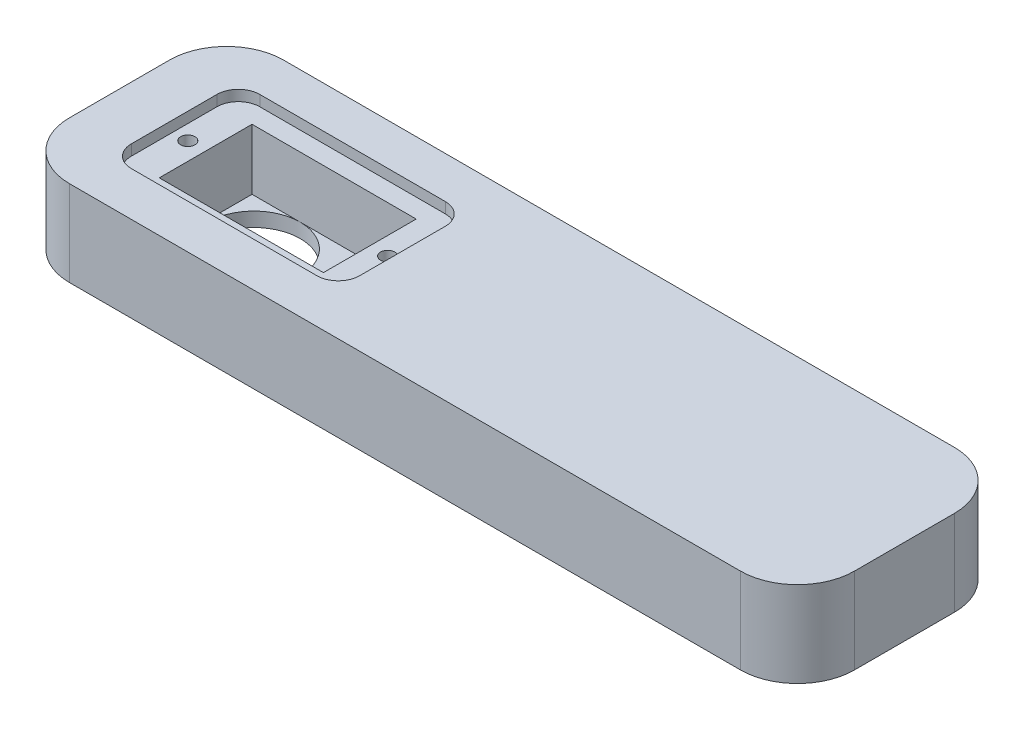
ISO-10303-21;
HEADER;
FILE_DESCRIPTION(('STEP AP214'),'2;1');
FILE_NAME('part.step','',(''),(''),'','','');
FILE_SCHEMA(('AUTOMOTIVE_DESIGN { 1 0 10303 214 1 1 1 1 }'));
ENDSEC;
DATA;
#1=APPLICATION_CONTEXT('core data for automotive mechanical design processes');
#2=APPLICATION_PROTOCOL_DEFINITION('international standard','automotive_design',2000,#1);
#3=PRODUCT_CONTEXT('',#1,'mechanical');
#4=PRODUCT('Part','Part','',(#3));
#5=PRODUCT_RELATED_PRODUCT_CATEGORY('part','',(#4));
#6=PRODUCT_DEFINITION_FORMATION('','',#4);
#7=PRODUCT_DEFINITION_CONTEXT('part definition',#1,'design');
#8=PRODUCT_DEFINITION('design','',#6,#7);
#9=PRODUCT_DEFINITION_SHAPE('','',#8);
#10=(LENGTH_UNIT() NAMED_UNIT(*) SI_UNIT(.MILLI.,.METRE.));
#11=(NAMED_UNIT(*) PLANE_ANGLE_UNIT() SI_UNIT($,.RADIAN.));
#12=(NAMED_UNIT(*) SI_UNIT($,.STERADIAN.) SOLID_ANGLE_UNIT());
#13=UNCERTAINTY_MEASURE_WITH_UNIT(LENGTH_MEASURE(1.E-05),#10,'distance_accuracy_value','');
#14=(GEOMETRIC_REPRESENTATION_CONTEXT(3) GLOBAL_UNCERTAINTY_ASSIGNED_CONTEXT((#13)) GLOBAL_UNIT_ASSIGNED_CONTEXT((#10,
#11,#12)) REPRESENTATION_CONTEXT('',''));
#15=CARTESIAN_POINT('',(0.,0.,0.));
#16=DIRECTION('',(0.,0.,1.));
#17=DIRECTION('',(1.,0.,0.));
#18=AXIS2_PLACEMENT_3D('',#15,#16,#17);
#19=CARTESIAN_POINT('',(-34.6791035291044,2.,-9.60810810810811));
#20=DIRECTION('',(0.,0.,-1.));
#21=DIRECTION('',(-1.,0.,0.));
#22=AXIS2_PLACEMENT_3D('',#19,#20,#21);
#23=PLANE('',#22);
#24=DIRECTION('',(1.,0.,0.));
#25=VECTOR('',#24,1.);
#26=CARTESIAN_POINT('',(-34.6791035291044,10.5,-9.60810810810811));
#27=LINE('',#26,#25);
#28=CARTESIAN_POINT('',(-34.6791035291044,10.5,-9.60810810810811));
#29=VERTEX_POINT('',#28);
#30=CARTESIAN_POINT('',(-11.6791035291044,10.5,-9.60810810810812));
#31=VERTEX_POINT('',#30);
#32=EDGE_CURVE('E179',#29,#31,#27,.T.);
#33=ORIENTED_EDGE('',*,*,#32,.F.);
#34=DIRECTION('',(0.,1.,0.));
#35=VECTOR('',#34,1.);
#36=CARTESIAN_POINT('',(-34.6791035291044,2.,-9.60810810810811));
#37=LINE('',#36,#35);
#38=CARTESIAN_POINT('',(-34.6791035291044,2.,-9.60810810810811));
#39=VERTEX_POINT('',#38);
#40=EDGE_CURVE('E202',#39,#29,#37,.T.);
#41=ORIENTED_EDGE('',*,*,#40,.F.);
#42=DIRECTION('',(-1.,0.,0.));
#43=VECTOR('',#42,1.);
#44=CARTESIAN_POINT('',(-34.6791035291044,2.,-9.60810810810811));
#45=LINE('',#44,#43);
#46=CARTESIAN_POINT('',(-27.9291035291044,2.,-9.60810810810811));
#47=VERTEX_POINT('',#46);
#48=EDGE_CURVE('E355',#47,#39,#45,.T.);
#49=ORIENTED_EDGE('',*,*,#48,.F.);
#50=CARTESIAN_POINT('',(-11.6791035291044,2.,-9.60810810810812));
#51=VERTEX_POINT('',#50);
#52=EDGE_CURVE('E204',#51,#47,#45,.T.);
#53=ORIENTED_EDGE('',*,*,#52,.F.);
#54=DIRECTION('',(0.,1.,0.));
#55=VECTOR('',#54,1.);
#56=CARTESIAN_POINT('',(-11.6791035291044,2.,-9.60810810810812));
#57=LINE('',#56,#55);
#58=EDGE_CURVE('E200',#51,#31,#57,.T.);
#59=ORIENTED_EDGE('',*,*,#58,.T.);
#60=EDGE_LOOP('',(#33,#41,#49,#53,#59));
#61=FACE_BOUND('',#60,.T.);
#62=ADVANCED_FACE('F32',(#61),#23,.F.);
#63=CARTESIAN_POINT('',(-34.6791035291044,2.,3.39189189189189));
#64=DIRECTION('',(0.,0.,1.));
#65=DIRECTION('',(1.,0.,0.));
#66=AXIS2_PLACEMENT_3D('',#63,#64,#65);
#67=PLANE('',#66);
#68=DIRECTION('',(-1.,0.,0.));
#69=VECTOR('',#68,1.);
#70=CARTESIAN_POINT('',(-34.6791035291044,10.5,3.39189189189189));
#71=LINE('',#70,#69);
#72=CARTESIAN_POINT('',(-11.6791035291044,10.5,3.39189189189188));
#73=VERTEX_POINT('',#72);
#74=CARTESIAN_POINT('',(-34.6791035291044,10.5,3.39189189189189));
#75=VERTEX_POINT('',#74);
#76=EDGE_CURVE('E176',#73,#75,#71,.T.);
#77=ORIENTED_EDGE('',*,*,#76,.F.);
#78=DIRECTION('',(0.,1.,0.));
#79=VECTOR('',#78,1.);
#80=CARTESIAN_POINT('',(-11.6791035291044,2.,3.39189189189188));
#81=LINE('',#80,#79);
#82=CARTESIAN_POINT('',(-11.6791035291044,2.,3.39189189189188));
#83=VERTEX_POINT('',#82);
#84=EDGE_CURVE('E191',#83,#73,#81,.T.);
#85=ORIENTED_EDGE('',*,*,#84,.F.);
#86=DIRECTION('',(1.,0.,0.));
#87=VECTOR('',#86,1.);
#88=CARTESIAN_POINT('',(-34.6791035291044,2.,3.39189189189189));
#89=LINE('',#88,#87);
#90=CARTESIAN_POINT('',(-27.9291035291044,2.,3.39189189189189));
#91=VERTEX_POINT('',#90);
#92=EDGE_CURVE('E350',#91,#83,#89,.T.);
#93=ORIENTED_EDGE('',*,*,#92,.F.);
#94=CARTESIAN_POINT('',(-34.6791035291044,2.,3.39189189189189));
#95=VERTEX_POINT('',#94);
#96=EDGE_CURVE('E351',#95,#91,#89,.T.);
#97=ORIENTED_EDGE('',*,*,#96,.F.);
#98=DIRECTION('',(0.,1.,0.));
#99=VECTOR('',#98,1.);
#100=CARTESIAN_POINT('',(-34.6791035291044,2.,3.39189189189189));
#101=LINE('',#100,#99);
#102=EDGE_CURVE('E194',#95,#75,#101,.T.);
#103=ORIENTED_EDGE('',*,*,#102,.T.);
#104=EDGE_LOOP('',(#77,#85,#93,#97,#103));
#105=FACE_BOUND('',#104,.T.);
#106=ADVANCED_FACE('F189',(#105),#67,.F.);
#107=CARTESIAN_POINT('',(-34.6791035291044,2.,-9.60810810810811));
#108=DIRECTION('',(-1.,0.,0.));
#109=DIRECTION('',(0.,0.,1.));
#110=AXIS2_PLACEMENT_3D('',#107,#108,#109);
#111=PLANE('',#110);
#112=DIRECTION('',(0.,0.,-1.));
#113=VECTOR('',#112,1.);
#114=CARTESIAN_POINT('',(-34.6791035291044,10.5,-9.60810810810811));
#115=LINE('',#114,#113);
#116=EDGE_CURVE('E345',#75,#29,#115,.T.);
#117=ORIENTED_EDGE('',*,*,#116,.F.);
#118=ORIENTED_EDGE('',*,*,#102,.F.);
#119=DIRECTION('',(0.,0.,1.));
#120=VECTOR('',#119,1.);
#121=CARTESIAN_POINT('',(-34.6791035291044,2.,-9.60810810810811));
#122=LINE('',#121,#120);
#123=EDGE_CURVE('E347',#39,#95,#122,.T.);
#124=ORIENTED_EDGE('',*,*,#123,.F.);
#125=ORIENTED_EDGE('',*,*,#40,.T.);
#126=EDGE_LOOP('',(#117,#118,#124,#125));
#127=FACE_BOUND('',#126,.T.);
#128=ADVANCED_FACE('F360',(#127),#111,.F.);
#129=CARTESIAN_POINT('',(-11.6791035291044,2.,-9.60810810810812));
#130=DIRECTION('',(1.,0.,0.));
#131=DIRECTION('',(0.,0.,-1.));
#132=AXIS2_PLACEMENT_3D('',#129,#130,#131);
#133=PLANE('',#132);
#134=DIRECTION('',(0.,0.,1.));
#135=VECTOR('',#134,1.);
#136=CARTESIAN_POINT('',(-11.6791035291044,10.5,-9.60810810810812));
#137=LINE('',#136,#135);
#138=EDGE_CURVE('E173',#31,#73,#137,.T.);
#139=ORIENTED_EDGE('',*,*,#138,.F.);
#140=ORIENTED_EDGE('',*,*,#58,.F.);
#141=DIRECTION('',(0.,0.,-1.));
#142=VECTOR('',#141,1.);
#143=CARTESIAN_POINT('',(-11.6791035291044,2.,-9.60810810810812));
#144=LINE('',#143,#142);
#145=EDGE_CURVE('E199',#83,#51,#144,.T.);
#146=ORIENTED_EDGE('',*,*,#145,.F.);
#147=ORIENTED_EDGE('',*,*,#84,.T.);
#148=EDGE_LOOP('',(#139,#140,#146,#147));
#149=FACE_BOUND('',#148,.T.);
#150=ADVANCED_FACE('F197',(#149),#133,.F.);
#151=CARTESIAN_POINT('',(-27.9291035291044,0.,-3.10810810810811));
#152=DIRECTION('',(0.,1.,0.));
#153=DIRECTION('',(0.,0.,1.));
#154=AXIS2_PLACEMENT_3D('',#151,#152,#153);
#155=CYLINDRICAL_SURFACE('',#154,6.5);
#156=CARTESIAN_POINT('',(-27.9291035291044,0.,-3.10810810810811));
#157=DIRECTION('',(0.,1.,0.));
#158=DIRECTION('',(0.,0.,1.));
#159=AXIS2_PLACEMENT_3D('',#156,#157,#158);
#160=CIRCLE('',#159,6.5);
#161=CARTESIAN_POINT('',(-27.9291035291044,0.,3.39189189189189));
#162=VERTEX_POINT('',#161);
#163=EDGE_CURVE('E208',#162,#162,#160,.T.);
#164=ORIENTED_EDGE('',*,*,#163,.F.);
#165=EDGE_LOOP('',(#164));
#166=FACE_BOUND('',#165,.T.);
#167=CARTESIAN_POINT('',(-27.9291035291044,2.,-3.10810810810811));
#168=DIRECTION('',(0.,1.,0.));
#169=DIRECTION('',(0.,0.,1.));
#170=AXIS2_PLACEMENT_3D('',#167,#168,#169);
#171=CIRCLE('',#170,6.5);
#172=EDGE_CURVE('E184',#91,#47,#171,.F.);
#173=ORIENTED_EDGE('',*,*,#172,.F.);
#174=EDGE_CURVE('E271',#47,#91,#171,.F.);
#175=ORIENTED_EDGE('',*,*,#174,.F.);
#176=EDGE_LOOP('',(#173,#175));
#177=FACE_BOUND('',#176,.T.);
#178=ADVANCED_FACE('F372',(#166,#177),#155,.F.);
#179=CARTESIAN_POINT('',(-46.7567567567568,12.,-18.1081081081081));
#180=DIRECTION('',(1.,0.,0.));
#181=DIRECTION('',(0.,0.,-1.));
#182=AXIS2_PLACEMENT_3D('',#179,#180,#181);
#183=PLANE('',#182);
#184=DIRECTION('',(0.,0.,1.));
#185=VECTOR('',#184,1.);
#186=CARTESIAN_POINT('',(-46.7567567567568,12.,-18.1081081081081));
#187=LINE('',#186,#185);
#188=CARTESIAN_POINT('',(-46.7567567567568,12.,-10.1081081081081));
#189=VERTEX_POINT('',#188);
#190=CARTESIAN_POINT('',(-46.7567567567568,12.,3.89189189189188));
#191=VERTEX_POINT('',#190);
#192=EDGE_CURVE('E212',#189,#191,#187,.T.);
#193=ORIENTED_EDGE('',*,*,#192,.F.);
#194=DIRECTION('',(0.,-1.,0.));
#195=VECTOR('',#194,1.);
#196=CARTESIAN_POINT('',(-46.7567567567568,12.,-10.1081081081081));
#197=LINE('',#196,#195);
#198=CARTESIAN_POINT('',(-46.7567567567568,0.,-10.1081081081081));
#199=VERTEX_POINT('',#198);
#200=EDGE_CURVE('E268',#189,#199,#197,.T.);
#201=ORIENTED_EDGE('',*,*,#200,.T.);
#202=DIRECTION('',(0.,0.,1.));
#203=VECTOR('',#202,1.);
#204=CARTESIAN_POINT('',(-46.7567567567568,0.,-18.1081081081081));
#205=LINE('',#204,#203);
#206=CARTESIAN_POINT('',(-46.7567567567568,0.,3.89189189189188));
#207=VERTEX_POINT('',#206);
#208=EDGE_CURVE('E211',#199,#207,#205,.T.);
#209=ORIENTED_EDGE('',*,*,#208,.T.);
#210=DIRECTION('',(0.,-1.,0.));
#211=VECTOR('',#210,1.);
#212=CARTESIAN_POINT('',(-46.7567567567568,12.,3.89189189189188));
#213=LINE('',#212,#211);
#214=EDGE_CURVE('E266',#207,#191,#213,.F.);
#215=ORIENTED_EDGE('',*,*,#214,.T.);
#216=EDGE_LOOP('',(#193,#201,#209,#215));
#217=FACE_BOUND('',#216,.T.);
#218=ADVANCED_FACE('F374',(#217),#183,.F.);
#219=CARTESIAN_POINT('',(-46.7567567567568,12.,11.8918918918919));
#220=DIRECTION('',(0.,0.,-1.));
#221=DIRECTION('',(-1.,0.,0.));
#222=AXIS2_PLACEMENT_3D('',#219,#220,#221);
#223=PLANE('',#222);
#224=DIRECTION('',(1.,0.,0.));
#225=VECTOR('',#224,1.);
#226=CARTESIAN_POINT('',(-46.7567567567568,0.,11.8918918918919));
#227=LINE('',#226,#225);
#228=CARTESIAN_POINT('',(-38.7567567567568,0.,11.8918918918919));
#229=VERTEX_POINT('',#228);
#230=CARTESIAN_POINT('',(55.2432432432432,0.,11.8918918918919));
#231=VERTEX_POINT('',#230);
#232=EDGE_CURVE('E228',#229,#231,#227,.T.);
#233=ORIENTED_EDGE('',*,*,#232,.T.);
#234=DIRECTION('',(0.,-1.,0.));
#235=VECTOR('',#234,1.);
#236=CARTESIAN_POINT('',(55.2432432432432,12.,11.8918918918919));
#237=LINE('',#236,#235);
#238=CARTESIAN_POINT('',(55.2432432432432,12.,11.8918918918919));
#239=VERTEX_POINT('',#238);
#240=EDGE_CURVE('E264',#231,#239,#237,.F.);
#241=ORIENTED_EDGE('',*,*,#240,.T.);
#242=DIRECTION('',(1.,0.,0.));
#243=VECTOR('',#242,1.);
#244=CARTESIAN_POINT('',(-46.7567567567568,12.,11.8918918918919));
#245=LINE('',#244,#243);
#246=CARTESIAN_POINT('',(-38.7567567567568,12.,11.8918918918919));
#247=VERTEX_POINT('',#246);
#248=EDGE_CURVE('E215',#247,#239,#245,.T.);
#249=ORIENTED_EDGE('',*,*,#248,.F.);
#250=DIRECTION('',(0.,-1.,0.));
#251=VECTOR('',#250,1.);
#252=CARTESIAN_POINT('',(-38.7567567567568,12.,11.8918918918919));
#253=LINE('',#252,#251);
#254=EDGE_CURVE('E261',#247,#229,#253,.T.);
#255=ORIENTED_EDGE('',*,*,#254,.T.);
#256=EDGE_LOOP('',(#233,#241,#249,#255));
#257=FACE_BOUND('',#256,.T.);
#258=ADVANCED_FACE('F381',(#257),#223,.F.);
#259=CARTESIAN_POINT('',(63.2432432432432,12.,-18.1081081081081));
#260=DIRECTION('',(-1.,0.,0.));
#261=DIRECTION('',(0.,0.,1.));
#262=AXIS2_PLACEMENT_3D('',#259,#260,#261);
#263=PLANE('',#262);
#264=DIRECTION('',(0.,0.,-1.));
#265=VECTOR('',#264,1.);
#266=CARTESIAN_POINT('',(63.2432432432432,0.,-18.1081081081081));
#267=LINE('',#266,#265);
#268=CARTESIAN_POINT('',(63.2432432432432,0.,3.89189189189188));
#269=VERTEX_POINT('',#268);
#270=CARTESIAN_POINT('',(63.2432432432432,0.,-10.1081081081081));
#271=VERTEX_POINT('',#270);
#272=EDGE_CURVE('E231',#269,#271,#267,.T.);
#273=ORIENTED_EDGE('',*,*,#272,.T.);
#274=DIRECTION('',(0.,-1.,0.));
#275=VECTOR('',#274,1.);
#276=CARTESIAN_POINT('',(63.2432432432432,12.,-10.1081081081081));
#277=LINE('',#276,#275);
#278=CARTESIAN_POINT('',(63.2432432432432,12.,-10.1081081081081));
#279=VERTEX_POINT('',#278);
#280=EDGE_CURVE('E251',#271,#279,#277,.F.);
#281=ORIENTED_EDGE('',*,*,#280,.T.);
#282=DIRECTION('',(0.,0.,-1.));
#283=VECTOR('',#282,1.);
#284=CARTESIAN_POINT('',(63.2432432432432,12.,-18.1081081081081));
#285=LINE('',#284,#283);
#286=CARTESIAN_POINT('',(63.2432432432432,12.,3.89189189189188));
#287=VERTEX_POINT('',#286);
#288=EDGE_CURVE('E219',#287,#279,#285,.T.);
#289=ORIENTED_EDGE('',*,*,#288,.F.);
#290=DIRECTION('',(0.,-1.,0.));
#291=VECTOR('',#290,1.);
#292=CARTESIAN_POINT('',(63.2432432432432,12.,3.89189189189188));
#293=LINE('',#292,#291);
#294=EDGE_CURVE('E248',#287,#269,#293,.T.);
#295=ORIENTED_EDGE('',*,*,#294,.T.);
#296=EDGE_LOOP('',(#273,#281,#289,#295));
#297=FACE_BOUND('',#296,.T.);
#298=ADVANCED_FACE('F635',(#297),#263,.F.);
#299=CARTESIAN_POINT('',(-46.7567567567568,12.,-18.1081081081081));
#300=DIRECTION('',(0.,0.,1.));
#301=DIRECTION('',(1.,0.,0.));
#302=AXIS2_PLACEMENT_3D('',#299,#300,#301);
#303=PLANE('',#302);
#304=DIRECTION('',(-1.,0.,0.));
#305=VECTOR('',#304,1.);
#306=CARTESIAN_POINT('',(-46.7567567567568,12.,-18.1081081081081));
#307=LINE('',#306,#305);
#308=CARTESIAN_POINT('',(55.2432432432432,12.,-18.1081081081081));
#309=VERTEX_POINT('',#308);
#310=CARTESIAN_POINT('',(-38.7567567567568,12.,-18.1081081081081));
#311=VERTEX_POINT('',#310);
#312=EDGE_CURVE('E222',#309,#311,#307,.T.);
#313=ORIENTED_EDGE('',*,*,#312,.F.);
#314=DIRECTION('',(0.,-1.,0.));
#315=VECTOR('',#314,1.);
#316=CARTESIAN_POINT('',(55.2432432432432,12.,-18.1081081081081));
#317=LINE('',#316,#315);
#318=CARTESIAN_POINT('',(55.2432432432432,0.,-18.1081081081081));
#319=VERTEX_POINT('',#318);
#320=EDGE_CURVE('E237',#309,#319,#317,.T.);
#321=ORIENTED_EDGE('',*,*,#320,.T.);
#322=DIRECTION('',(-1.,0.,0.));
#323=VECTOR('',#322,1.);
#324=CARTESIAN_POINT('',(-46.7567567567568,0.,-18.1081081081081));
#325=LINE('',#324,#323);
#326=CARTESIAN_POINT('',(-38.7567567567568,0.,-18.1081081081081));
#327=VERTEX_POINT('',#326);
#328=EDGE_CURVE('E216',#319,#327,#325,.T.);
#329=ORIENTED_EDGE('',*,*,#328,.T.);
#330=DIRECTION('',(0.,-1.,0.));
#331=VECTOR('',#330,1.);
#332=CARTESIAN_POINT('',(-38.7567567567568,12.,-18.1081081081081));
#333=LINE('',#332,#331);
#334=EDGE_CURVE('E225',#327,#311,#333,.F.);
#335=ORIENTED_EDGE('',*,*,#334,.T.);
#336=EDGE_LOOP('',(#313,#321,#329,#335));
#337=FACE_BOUND('',#336,.T.);
#338=ADVANCED_FACE('F416',(#337),#303,.F.);
#339=CARTESIAN_POINT('',(0.,12.,0.));
#340=DIRECTION('',(0.,1.,0.));
#341=DIRECTION('',(0.,0.,1.));
#342=AXIS2_PLACEMENT_3D('',#339,#340,#341);
#343=PLANE('',#342);
#344=DIRECTION('',(0.,0.,1.));
#345=VECTOR('',#344,1.);
#346=CARTESIAN_POINT('',(-39.2622805933264,12.,-12.273133416281));
#347=LINE('',#346,#345);
#348=CARTESIAN_POINT('',(-39.2622805933264,12.,-9.27313341628103));
#349=VERTEX_POINT('',#348);
#350=CARTESIAN_POINT('',(-39.2622805933264,12.,2.72686658371897));
#351=VERTEX_POINT('',#350);
#352=EDGE_CURVE('E318',#349,#351,#347,.T.);
#353=ORIENTED_EDGE('',*,*,#352,.F.);
#354=CARTESIAN_POINT('',(-36.2622805933264,12.,-9.27313341628103));
#355=DIRECTION('',(0.,1.,0.));
#356=DIRECTION('',(0.,0.,1.));
#357=AXIS2_PLACEMENT_3D('',#354,#355,#356);
#358=CIRCLE('',#357,3.);
#359=CARTESIAN_POINT('',(-36.2622805933264,12.,-12.273133416281));
#360=VERTEX_POINT('',#359);
#361=EDGE_CURVE('E40',#349,#360,#358,.F.);
#362=ORIENTED_EDGE('',*,*,#361,.T.);
#363=DIRECTION('',(-1.,0.,0.));
#364=VECTOR('',#363,1.);
#365=CARTESIAN_POINT('',(-39.2622805933264,12.,-12.273133416281));
#366=LINE('',#365,#364);
#367=CARTESIAN_POINT('',(-10.2622805933264,12.,-12.273133416281));
#368=VERTEX_POINT('',#367);
#369=EDGE_CURVE('E342',#368,#360,#366,.T.);
#370=ORIENTED_EDGE('',*,*,#369,.F.);
#371=CARTESIAN_POINT('',(-10.2622805933264,12.,-9.27313341628103));
#372=DIRECTION('',(0.,1.,0.));
#373=DIRECTION('',(0.,0.,1.));
#374=AXIS2_PLACEMENT_3D('',#371,#372,#373);
#375=CIRCLE('',#374,3.);
#376=CARTESIAN_POINT('',(-7.2622805933264,12.,-9.27313341628103));
#377=VERTEX_POINT('',#376);
#378=EDGE_CURVE('E11',#368,#377,#375,.F.);
#379=ORIENTED_EDGE('',*,*,#378,.T.);
#380=DIRECTION('',(0.,0.,-1.));
#381=VECTOR('',#380,1.);
#382=CARTESIAN_POINT('',(-7.2622805933264,12.,-12.273133416281));
#383=LINE('',#382,#381);
#384=CARTESIAN_POINT('',(-7.2622805933264,12.,2.72686658371897));
#385=VERTEX_POINT('',#384);
#386=EDGE_CURVE('E309',#385,#377,#383,.T.);
#387=ORIENTED_EDGE('',*,*,#386,.F.);
#388=CARTESIAN_POINT('',(-10.2622805933264,12.,2.72686658371897));
#389=DIRECTION('',(0.,1.,0.));
#390=DIRECTION('',(0.,0.,1.));
#391=AXIS2_PLACEMENT_3D('',#388,#389,#390);
#392=CIRCLE('',#391,3.);
#393=CARTESIAN_POINT('',(-10.2622805933264,12.,5.72686658371897));
#394=VERTEX_POINT('',#393);
#395=EDGE_CURVE('E301',#385,#394,#392,.F.);
#396=ORIENTED_EDGE('',*,*,#395,.T.);
#397=DIRECTION('',(1.,0.,0.));
#398=VECTOR('',#397,1.);
#399=CARTESIAN_POINT('',(-39.2622805933264,12.,5.72686658371897));
#400=LINE('',#399,#398);
#401=CARTESIAN_POINT('',(-36.2622805933264,12.,5.72686658371897));
#402=VERTEX_POINT('',#401);
#403=EDGE_CURVE('E307',#402,#394,#400,.T.);
#404=ORIENTED_EDGE('',*,*,#403,.F.);
#405=CARTESIAN_POINT('',(-36.2622805933264,12.,2.72686658371897));
#406=DIRECTION('',(0.,1.,0.));
#407=DIRECTION('',(0.,0.,1.));
#408=AXIS2_PLACEMENT_3D('',#405,#406,#407);
#409=CIRCLE('',#408,3.);
#410=EDGE_CURVE('E299',#402,#351,#409,.F.);
#411=ORIENTED_EDGE('',*,*,#410,.T.);
#412=EDGE_LOOP('',(#353,#362,#370,#379,#387,#396,#404,#411));
#413=FACE_BOUND('',#412,.T.);
#414=ORIENTED_EDGE('',*,*,#288,.T.);
#415=CARTESIAN_POINT('',(55.2432432432432,12.,-10.1081081081081));
#416=DIRECTION('',(0.,1.,0.));
#417=DIRECTION('',(0.,0.,1.));
#418=AXIS2_PLACEMENT_3D('',#415,#416,#417);
#419=CIRCLE('',#418,8.);
#420=EDGE_CURVE('E259',#279,#309,#419,.T.);
#421=ORIENTED_EDGE('',*,*,#420,.T.);
#422=ORIENTED_EDGE('',*,*,#312,.T.);
#423=CARTESIAN_POINT('',(-38.7567567567568,12.,-10.1081081081081));
#424=DIRECTION('',(0.,1.,0.));
#425=DIRECTION('',(0.,0.,1.));
#426=AXIS2_PLACEMENT_3D('',#423,#424,#425);
#427=CIRCLE('',#426,8.);
#428=EDGE_CURVE('E255',#311,#189,#427,.T.);
#429=ORIENTED_EDGE('',*,*,#428,.T.);
#430=ORIENTED_EDGE('',*,*,#192,.T.);
#431=CARTESIAN_POINT('',(-38.7567567567568,12.,3.89189189189188));
#432=DIRECTION('',(0.,1.,0.));
#433=DIRECTION('',(0.,0.,1.));
#434=AXIS2_PLACEMENT_3D('',#431,#432,#433);
#435=CIRCLE('',#434,8.);
#436=EDGE_CURVE('E253',#191,#247,#435,.T.);
#437=ORIENTED_EDGE('',*,*,#436,.T.);
#438=ORIENTED_EDGE('',*,*,#248,.T.);
#439=CARTESIAN_POINT('',(55.2432432432432,12.,3.89189189189188));
#440=DIRECTION('',(0.,1.,0.));
#441=DIRECTION('',(0.,0.,1.));
#442=AXIS2_PLACEMENT_3D('',#439,#440,#441);
#443=CIRCLE('',#442,8.);
#444=EDGE_CURVE('E257',#239,#287,#443,.T.);
#445=ORIENTED_EDGE('',*,*,#444,.T.);
#446=EDGE_LOOP('',(#414,#421,#422,#429,#430,#437,#438,#445));
#447=FACE_BOUND('',#446,.T.);
#448=ADVANCED_FACE('F305',(#413,#447),#343,.T.);
#449=CARTESIAN_POINT('',(0.,0.,0.));
#450=DIRECTION('',(0.,1.,0.));
#451=DIRECTION('',(0.,0.,1.));
#452=AXIS2_PLACEMENT_3D('',#449,#450,#451);
#453=PLANE('',#452);
#454=ORIENTED_EDGE('',*,*,#163,.T.);
#455=EDGE_LOOP('',(#454));
#456=FACE_BOUND('',#455,.T.);
#457=ORIENTED_EDGE('',*,*,#328,.F.);
#458=CARTESIAN_POINT('',(55.2432432432432,0.,-10.1081081081081));
#459=DIRECTION('',(0.,1.,0.));
#460=DIRECTION('',(0.,0.,1.));
#461=AXIS2_PLACEMENT_3D('',#458,#459,#460);
#462=CIRCLE('',#461,8.);
#463=EDGE_CURVE('E246',#319,#271,#462,.F.);
#464=ORIENTED_EDGE('',*,*,#463,.T.);
#465=ORIENTED_EDGE('',*,*,#272,.F.);
#466=CARTESIAN_POINT('',(55.2432432432432,0.,3.89189189189188));
#467=DIRECTION('',(0.,1.,0.));
#468=DIRECTION('',(0.,0.,1.));
#469=AXIS2_PLACEMENT_3D('',#466,#467,#468);
#470=CIRCLE('',#469,8.);
#471=EDGE_CURVE('E244',#269,#231,#470,.F.);
#472=ORIENTED_EDGE('',*,*,#471,.T.);
#473=ORIENTED_EDGE('',*,*,#232,.F.);
#474=CARTESIAN_POINT('',(-38.7567567567568,0.,3.89189189189188));
#475=DIRECTION('',(0.,1.,0.));
#476=DIRECTION('',(0.,0.,1.));
#477=AXIS2_PLACEMENT_3D('',#474,#475,#476);
#478=CIRCLE('',#477,8.);
#479=EDGE_CURVE('E240',#229,#207,#478,.F.);
#480=ORIENTED_EDGE('',*,*,#479,.T.);
#481=ORIENTED_EDGE('',*,*,#208,.F.);
#482=CARTESIAN_POINT('',(-38.7567567567568,0.,-10.1081081081081));
#483=DIRECTION('',(0.,1.,0.));
#484=DIRECTION('',(0.,0.,1.));
#485=AXIS2_PLACEMENT_3D('',#482,#483,#484);
#486=CIRCLE('',#485,8.);
#487=EDGE_CURVE('E242',#199,#327,#486,.F.);
#488=ORIENTED_EDGE('',*,*,#487,.T.);
#489=EDGE_LOOP('',(#457,#464,#465,#472,#473,#480,#481,#488));
#490=FACE_BOUND('',#489,.T.);
#491=ADVANCED_FACE('F415',(#456,#490),#453,.F.);
#492=CARTESIAN_POINT('',(55.2432432432432,12.,-10.1081081081081));
#493=DIRECTION('',(0.,-1.,0.));
#494=DIRECTION('',(0.,0.,-1.));
#495=AXIS2_PLACEMENT_3D('',#492,#493,#494);
#496=CYLINDRICAL_SURFACE('',#495,8.);
#497=ORIENTED_EDGE('',*,*,#420,.F.);
#498=ORIENTED_EDGE('',*,*,#280,.F.);
#499=ORIENTED_EDGE('',*,*,#463,.F.);
#500=ORIENTED_EDGE('',*,*,#320,.F.);
#501=EDGE_LOOP('',(#497,#498,#499,#500));
#502=FACE_BOUND('',#501,.T.);
#503=ADVANCED_FACE('F598',(#502),#496,.T.);
#504=CARTESIAN_POINT('',(55.2432432432432,12.,3.89189189189188));
#505=DIRECTION('',(0.,-1.,0.));
#506=DIRECTION('',(0.,0.,-1.));
#507=AXIS2_PLACEMENT_3D('',#504,#505,#506);
#508=CYLINDRICAL_SURFACE('',#507,8.);
#509=ORIENTED_EDGE('',*,*,#444,.F.);
#510=ORIENTED_EDGE('',*,*,#240,.F.);
#511=ORIENTED_EDGE('',*,*,#471,.F.);
#512=ORIENTED_EDGE('',*,*,#294,.F.);
#513=EDGE_LOOP('',(#509,#510,#511,#512));
#514=FACE_BOUND('',#513,.T.);
#515=ADVANCED_FACE('F590',(#514),#508,.T.);
#516=CARTESIAN_POINT('',(-38.7567567567568,12.,-10.1081081081081));
#517=DIRECTION('',(0.,-1.,0.));
#518=DIRECTION('',(0.,0.,-1.));
#519=AXIS2_PLACEMENT_3D('',#516,#517,#518);
#520=CYLINDRICAL_SURFACE('',#519,8.);
#521=ORIENTED_EDGE('',*,*,#428,.F.);
#522=ORIENTED_EDGE('',*,*,#334,.F.);
#523=ORIENTED_EDGE('',*,*,#487,.F.);
#524=ORIENTED_EDGE('',*,*,#200,.F.);
#525=EDGE_LOOP('',(#521,#522,#523,#524));
#526=FACE_BOUND('',#525,.T.);
#527=ADVANCED_FACE('F581',(#526),#520,.T.);
#528=CARTESIAN_POINT('',(-38.7567567567568,12.,3.89189189189188));
#529=DIRECTION('',(0.,-1.,0.));
#530=DIRECTION('',(0.,0.,-1.));
#531=AXIS2_PLACEMENT_3D('',#528,#529,#530);
#532=CYLINDRICAL_SURFACE('',#531,8.);
#533=ORIENTED_EDGE('',*,*,#436,.F.);
#534=ORIENTED_EDGE('',*,*,#214,.F.);
#535=ORIENTED_EDGE('',*,*,#479,.F.);
#536=ORIENTED_EDGE('',*,*,#254,.F.);
#537=EDGE_LOOP('',(#533,#534,#535,#536));
#538=FACE_BOUND('',#537,.T.);
#539=ADVANCED_FACE('F575',(#538),#532,.T.);
#540=CARTESIAN_POINT('',(0.,2.,0.));
#541=DIRECTION('',(0.,1.,0.));
#542=DIRECTION('',(0.,0.,1.));
#543=AXIS2_PLACEMENT_3D('',#540,#541,#542);
#544=PLANE('',#543);
#545=ORIENTED_EDGE('',*,*,#172,.T.);
#546=ORIENTED_EDGE('',*,*,#48,.T.);
#547=ORIENTED_EDGE('',*,*,#123,.T.);
#548=ORIENTED_EDGE('',*,*,#96,.T.);
#549=EDGE_LOOP('',(#545,#546,#547,#548));
#550=FACE_BOUND('',#549,.T.);
#551=ADVANCED_FACE('F370',(#550),#544,.T.);
#552=ORIENTED_EDGE('',*,*,#174,.T.);
#553=ORIENTED_EDGE('',*,*,#92,.T.);
#554=ORIENTED_EDGE('',*,*,#145,.T.);
#555=ORIENTED_EDGE('',*,*,#52,.T.);
#556=EDGE_LOOP('',(#552,#553,#554,#555));
#557=FACE_BOUND('',#556,.T.);
#558=ADVANCED_FACE('F366',(#557),#544,.T.);
#559=CARTESIAN_POINT('',(0.,10.5,0.));
#560=DIRECTION('',(0.,1.,0.));
#561=DIRECTION('',(0.,0.,1.));
#562=AXIS2_PLACEMENT_3D('',#559,#560,#561);
#563=PLANE('',#562);
#564=CARTESIAN_POINT('',(-37.1791035291044,10.5,-3.10810810810811));
#565=DIRECTION('',(0.,1.,0.));
#566=DIRECTION('',(0.,0.,1.));
#567=AXIS2_PLACEMENT_3D('',#564,#565,#566);
#568=CIRCLE('',#567,0.999999999999998);
#569=CARTESIAN_POINT('',(-37.1791035291044,10.5,-2.10810810810811));
#570=VERTEX_POINT('',#569);
#571=EDGE_CURVE('E542',#570,#570,#568,.T.);
#572=ORIENTED_EDGE('',*,*,#571,.F.);
#573=EDGE_LOOP('',(#572));
#574=FACE_BOUND('',#573,.T.);
#575=CARTESIAN_POINT('',(-9.17910352910443,10.5,-3.10810810810811));
#576=DIRECTION('',(0.,1.,0.));
#577=DIRECTION('',(0.,0.,-1.));
#578=AXIS2_PLACEMENT_3D('',#575,#576,#577);
#579=CIRCLE('',#578,0.999999999999998);
#580=CARTESIAN_POINT('',(-9.17910352910443,10.5,-4.10810810810811));
#581=VERTEX_POINT('',#580);
#582=EDGE_CURVE('E550',#581,#581,#579,.T.);
#583=ORIENTED_EDGE('',*,*,#582,.F.);
#584=EDGE_LOOP('',(#583));
#585=FACE_BOUND('',#584,.T.);
#586=DIRECTION('',(0.,0.,1.));
#587=VECTOR('',#586,1.);
#588=CARTESIAN_POINT('',(-39.2622805933264,10.5,-12.273133416281));
#589=LINE('',#588,#587);
#590=CARTESIAN_POINT('',(-39.2622805933264,10.5,-9.27313341628103));
#591=VERTEX_POINT('',#590);
#592=CARTESIAN_POINT('',(-39.2622805933264,10.5,2.72686658371897));
#593=VERTEX_POINT('',#592);
#594=EDGE_CURVE('E334',#591,#593,#589,.T.);
#595=ORIENTED_EDGE('',*,*,#594,.T.);
#596=CARTESIAN_POINT('',(-36.2622805933264,10.5,2.72686658371897));
#597=DIRECTION('',(0.,1.,0.));
#598=DIRECTION('',(0.,0.,1.));
#599=AXIS2_PLACEMENT_3D('',#596,#597,#598);
#600=CIRCLE('',#599,3.);
#601=CARTESIAN_POINT('',(-36.2622805933264,10.5,5.72686658371897));
#602=VERTEX_POINT('',#601);
#603=EDGE_CURVE('E288',#593,#602,#600,.T.);
#604=ORIENTED_EDGE('',*,*,#603,.T.);
#605=DIRECTION('',(1.,0.,0.));
#606=VECTOR('',#605,1.);
#607=CARTESIAN_POINT('',(-39.2622805933264,10.5,5.72686658371897));
#608=LINE('',#607,#606);
#609=CARTESIAN_POINT('',(-10.2622805933264,10.5,5.72686658371897));
#610=VERTEX_POINT('',#609);
#611=EDGE_CURVE('E328',#602,#610,#608,.T.);
#612=ORIENTED_EDGE('',*,*,#611,.T.);
#613=CARTESIAN_POINT('',(-10.2622805933264,10.5,2.72686658371897));
#614=DIRECTION('',(0.,1.,0.));
#615=DIRECTION('',(0.,0.,1.));
#616=AXIS2_PLACEMENT_3D('',#613,#614,#615);
#617=CIRCLE('',#616,3.);
#618=CARTESIAN_POINT('',(-7.2622805933264,10.5,2.72686658371897));
#619=VERTEX_POINT('',#618);
#620=EDGE_CURVE('E286',#610,#619,#617,.T.);
#621=ORIENTED_EDGE('',*,*,#620,.T.);
#622=DIRECTION('',(0.,0.,-1.));
#623=VECTOR('',#622,1.);
#624=CARTESIAN_POINT('',(-7.2622805933264,10.5,-12.273133416281));
#625=LINE('',#624,#623);
#626=CARTESIAN_POINT('',(-7.2622805933264,10.5,-9.27313341628103));
#627=VERTEX_POINT('',#626);
#628=EDGE_CURVE('E326',#619,#627,#625,.T.);
#629=ORIENTED_EDGE('',*,*,#628,.T.);
#630=CARTESIAN_POINT('',(-10.2622805933264,10.5,-9.27313341628103));
#631=DIRECTION('',(0.,1.,0.));
#632=DIRECTION('',(0.,0.,1.));
#633=AXIS2_PLACEMENT_3D('',#630,#631,#632);
#634=CIRCLE('',#633,3.);
#635=CARTESIAN_POINT('',(-10.2622805933264,10.5,-12.273133416281));
#636=VERTEX_POINT('',#635);
#637=EDGE_CURVE('E282',#627,#636,#634,.T.);
#638=ORIENTED_EDGE('',*,*,#637,.T.);
#639=DIRECTION('',(-1.,0.,0.));
#640=VECTOR('',#639,1.);
#641=CARTESIAN_POINT('',(-39.2622805933264,10.5,-12.273133416281));
#642=LINE('',#641,#640);
#643=CARTESIAN_POINT('',(-36.2622805933264,10.5,-12.273133416281));
#644=VERTEX_POINT('',#643);
#645=EDGE_CURVE('E195',#636,#644,#642,.T.);
#646=ORIENTED_EDGE('',*,*,#645,.T.);
#647=CARTESIAN_POINT('',(-36.2622805933264,10.5,-9.27313341628103));
#648=DIRECTION('',(0.,1.,0.));
#649=DIRECTION('',(0.,0.,1.));
#650=AXIS2_PLACEMENT_3D('',#647,#648,#649);
#651=CIRCLE('',#650,3.);
#652=EDGE_CURVE('E284',#644,#591,#651,.T.);
#653=ORIENTED_EDGE('',*,*,#652,.T.);
#654=EDGE_LOOP('',(#595,#604,#612,#621,#629,#638,#646,#653));
#655=FACE_BOUND('',#654,.T.);
#656=ORIENTED_EDGE('',*,*,#116,.T.);
#657=ORIENTED_EDGE('',*,*,#32,.T.);
#658=ORIENTED_EDGE('',*,*,#138,.T.);
#659=ORIENTED_EDGE('',*,*,#76,.T.);
#660=EDGE_LOOP('',(#656,#657,#658,#659));
#661=FACE_BOUND('',#660,.T.);
#662=ADVANCED_FACE('F175',(#574,#585,#655,#661),#563,.T.);
#663=CARTESIAN_POINT('',(-39.2622805933264,10.5,-12.273133416281));
#664=DIRECTION('',(-1.,0.,0.));
#665=DIRECTION('',(0.,0.,1.));
#666=AXIS2_PLACEMENT_3D('',#663,#664,#665);
#667=PLANE('',#666);
#668=ORIENTED_EDGE('',*,*,#352,.T.);
#669=DIRECTION('',(0.,1.,0.));
#670=VECTOR('',#669,1.);
#671=CARTESIAN_POINT('',(-39.2622805933264,10.5,2.72686658371897));
#672=LINE('',#671,#670);
#673=EDGE_CURVE('E280',#351,#593,#672,.F.);
#674=ORIENTED_EDGE('',*,*,#673,.T.);
#675=ORIENTED_EDGE('',*,*,#594,.F.);
#676=DIRECTION('',(0.,1.,0.));
#677=VECTOR('',#676,1.);
#678=CARTESIAN_POINT('',(-39.2622805933264,12.,-9.27313341628103));
#679=LINE('',#678,#677);
#680=EDGE_CURVE('E277',#591,#349,#679,.T.);
#681=ORIENTED_EDGE('',*,*,#680,.T.);
#682=EDGE_LOOP('',(#668,#674,#675,#681));
#683=FACE_BOUND('',#682,.T.);
#684=ADVANCED_FACE('F424',(#683),#667,.F.);
#685=CARTESIAN_POINT('',(-39.2622805933264,10.5,-12.273133416281));
#686=DIRECTION('',(0.,0.,-1.));
#687=DIRECTION('',(-1.,0.,0.));
#688=AXIS2_PLACEMENT_3D('',#685,#686,#687);
#689=PLANE('',#688);
#690=ORIENTED_EDGE('',*,*,#369,.T.);
#691=DIRECTION('',(0.,1.,0.));
#692=VECTOR('',#691,1.);
#693=CARTESIAN_POINT('',(-36.2622805933264,10.5,-12.273133416281));
#694=LINE('',#693,#692);
#695=EDGE_CURVE('E297',#360,#644,#694,.F.);
#696=ORIENTED_EDGE('',*,*,#695,.T.);
#697=ORIENTED_EDGE('',*,*,#645,.F.);
#698=DIRECTION('',(0.,1.,0.));
#699=VECTOR('',#698,1.);
#700=CARTESIAN_POINT('',(-10.2622805933264,12.,-12.273133416281));
#701=LINE('',#700,#699);
#702=EDGE_CURVE('E295',#636,#368,#701,.T.);
#703=ORIENTED_EDGE('',*,*,#702,.T.);
#704=EDGE_LOOP('',(#690,#696,#697,#703));
#705=FACE_BOUND('',#704,.T.);
#706=ADVANCED_FACE('F429',(#705),#689,.F.);
#707=CARTESIAN_POINT('',(-7.2622805933264,10.5,-12.273133416281));
#708=DIRECTION('',(1.,0.,0.));
#709=DIRECTION('',(0.,0.,-1.));
#710=AXIS2_PLACEMENT_3D('',#707,#708,#709);
#711=PLANE('',#710);
#712=ORIENTED_EDGE('',*,*,#628,.F.);
#713=DIRECTION('',(0.,1.,0.));
#714=VECTOR('',#713,1.);
#715=CARTESIAN_POINT('',(-7.2622805933264,12.,2.72686658371897));
#716=LINE('',#715,#714);
#717=EDGE_CURVE('E292',#619,#385,#716,.T.);
#718=ORIENTED_EDGE('',*,*,#717,.T.);
#719=ORIENTED_EDGE('',*,*,#386,.T.);
#720=DIRECTION('',(0.,1.,0.));
#721=VECTOR('',#720,1.);
#722=CARTESIAN_POINT('',(-7.2622805933264,10.5,-9.27313341628103));
#723=LINE('',#722,#721);
#724=EDGE_CURVE('E290',#377,#627,#723,.F.);
#725=ORIENTED_EDGE('',*,*,#724,.T.);
#726=EDGE_LOOP('',(#712,#718,#719,#725));
#727=FACE_BOUND('',#726,.T.);
#728=ADVANCED_FACE('F330',(#727),#711,.F.);
#729=CARTESIAN_POINT('',(-39.2622805933264,10.5,5.72686658371897));
#730=DIRECTION('',(0.,0.,1.));
#731=DIRECTION('',(1.,0.,0.));
#732=AXIS2_PLACEMENT_3D('',#729,#730,#731);
#733=PLANE('',#732);
#734=ORIENTED_EDGE('',*,*,#611,.F.);
#735=DIRECTION('',(0.,1.,0.));
#736=VECTOR('',#735,1.);
#737=CARTESIAN_POINT('',(-36.2622805933264,12.,5.72686658371897));
#738=LINE('',#737,#736);
#739=EDGE_CURVE('E274',#602,#402,#738,.T.);
#740=ORIENTED_EDGE('',*,*,#739,.T.);
#741=ORIENTED_EDGE('',*,*,#403,.T.);
#742=DIRECTION('',(0.,1.,0.));
#743=VECTOR('',#742,1.);
#744=CARTESIAN_POINT('',(-10.2622805933264,10.5,5.72686658371897));
#745=LINE('',#744,#743);
#746=EDGE_CURVE('E183',#394,#610,#745,.F.);
#747=ORIENTED_EDGE('',*,*,#746,.T.);
#748=EDGE_LOOP('',(#734,#740,#741,#747));
#749=FACE_BOUND('',#748,.T.);
#750=ADVANCED_FACE('F315',(#749),#733,.F.);
#751=CARTESIAN_POINT('',(-36.2622805933264,10.5,2.72686658371897));
#752=DIRECTION('',(0.,-1.,0.));
#753=DIRECTION('',(0.,0.,-1.));
#754=AXIS2_PLACEMENT_3D('',#751,#752,#753);
#755=CYLINDRICAL_SURFACE('',#754,3.);
#756=ORIENTED_EDGE('',*,*,#603,.F.);
#757=ORIENTED_EDGE('',*,*,#673,.F.);
#758=ORIENTED_EDGE('',*,*,#410,.F.);
#759=ORIENTED_EDGE('',*,*,#739,.F.);
#760=EDGE_LOOP('',(#756,#757,#758,#759));
#761=FACE_BOUND('',#760,.T.);
#762=ADVANCED_FACE('F457',(#761),#755,.F.);
#763=CARTESIAN_POINT('',(-10.2622805933264,10.5,2.72686658371897));
#764=DIRECTION('',(0.,-1.,0.));
#765=DIRECTION('',(0.,0.,-1.));
#766=AXIS2_PLACEMENT_3D('',#763,#764,#765);
#767=CYLINDRICAL_SURFACE('',#766,3.);
#768=ORIENTED_EDGE('',*,*,#620,.F.);
#769=ORIENTED_EDGE('',*,*,#746,.F.);
#770=ORIENTED_EDGE('',*,*,#395,.F.);
#771=ORIENTED_EDGE('',*,*,#717,.F.);
#772=EDGE_LOOP('',(#768,#769,#770,#771));
#773=FACE_BOUND('',#772,.T.);
#774=ADVANCED_FACE('F321',(#773),#767,.F.);
#775=CARTESIAN_POINT('',(-36.2622805933264,10.5,-9.27313341628103));
#776=DIRECTION('',(0.,-1.,0.));
#777=DIRECTION('',(0.,0.,-1.));
#778=AXIS2_PLACEMENT_3D('',#775,#776,#777);
#779=CYLINDRICAL_SURFACE('',#778,3.);
#780=ORIENTED_EDGE('',*,*,#652,.F.);
#781=ORIENTED_EDGE('',*,*,#695,.F.);
#782=ORIENTED_EDGE('',*,*,#361,.F.);
#783=ORIENTED_EDGE('',*,*,#680,.F.);
#784=EDGE_LOOP('',(#780,#781,#782,#783));
#785=FACE_BOUND('',#784,.T.);
#786=ADVANCED_FACE('F475',(#785),#779,.F.);
#787=CARTESIAN_POINT('',(-10.2622805933264,10.5,-9.27313341628103));
#788=DIRECTION('',(0.,-1.,0.));
#789=DIRECTION('',(0.,0.,-1.));
#790=AXIS2_PLACEMENT_3D('',#787,#788,#789);
#791=CYLINDRICAL_SURFACE('',#790,3.);
#792=ORIENTED_EDGE('',*,*,#637,.F.);
#793=ORIENTED_EDGE('',*,*,#724,.F.);
#794=ORIENTED_EDGE('',*,*,#378,.F.);
#795=ORIENTED_EDGE('',*,*,#702,.F.);
#796=EDGE_LOOP('',(#792,#793,#794,#795));
#797=FACE_BOUND('',#796,.T.);
#798=ADVANCED_FACE('F34',(#797),#791,.F.);
#799=CARTESIAN_POINT('',(-9.17910352910443,6.5,-3.10810810810811));
#800=DIRECTION('',(0.,1.,0.));
#801=DIRECTION('',(0.,0.,1.));
#802=AXIS2_PLACEMENT_3D('',#799,#800,#801);
#803=CYLINDRICAL_SURFACE('',#802,0.999999999999998);
#804=CARTESIAN_POINT('',(-9.17910352910443,6.5,-3.10810810810811));
#805=DIRECTION('',(0.,1.,0.));
#806=DIRECTION('',(0.,0.,-1.));
#807=AXIS2_PLACEMENT_3D('',#804,#805,#806);
#808=CIRCLE('',#807,0.999999999999998);
#809=CARTESIAN_POINT('',(-9.17910352910443,6.5,-4.10810810810811));
#810=VERTEX_POINT('',#809);
#811=EDGE_CURVE('E545',#810,#810,#808,.T.);
#812=ORIENTED_EDGE('',*,*,#811,.F.);
#813=EDGE_LOOP('',(#812));
#814=FACE_BOUND('',#813,.T.);
#815=ORIENTED_EDGE('',*,*,#582,.T.);
#816=EDGE_LOOP('',(#815));
#817=FACE_BOUND('',#816,.T.);
#818=ADVANCED_FACE('F492',(#814,#817),#803,.F.);
#819=CARTESIAN_POINT('',(-9.17910352910443,6.5,-3.10810810810811));
#820=DIRECTION('',(0.,-1.,0.));
#821=DIRECTION('',(0.,0.,-1.));
#822=AXIS2_PLACEMENT_3D('',#819,#820,#821);
#823=PLANE('',#822);
#824=ORIENTED_EDGE('',*,*,#811,.T.);
#825=EDGE_LOOP('',(#824));
#826=FACE_BOUND('',#825,.T.);
#827=ADVANCED_FACE('F506',(#826),#823,.F.);
#828=CARTESIAN_POINT('',(-37.1791035291044,6.5,-3.10810810810811));
#829=DIRECTION('',(0.,1.,0.));
#830=DIRECTION('',(0.,0.,1.));
#831=AXIS2_PLACEMENT_3D('',#828,#829,#830);
#832=CYLINDRICAL_SURFACE('',#831,0.999999999999998);
#833=CARTESIAN_POINT('',(-37.1791035291044,6.5,-3.10810810810811));
#834=DIRECTION('',(0.,1.,0.));
#835=DIRECTION('',(0.,0.,1.));
#836=AXIS2_PLACEMENT_3D('',#833,#834,#835);
#837=CIRCLE('',#836,0.999999999999998);
#838=CARTESIAN_POINT('',(-37.1791035291044,6.5,-2.10810810810811));
#839=VERTEX_POINT('',#838);
#840=EDGE_CURVE('E339',#839,#839,#837,.T.);
#841=ORIENTED_EDGE('',*,*,#840,.F.);
#842=EDGE_LOOP('',(#841));
#843=FACE_BOUND('',#842,.T.);
#844=ORIENTED_EDGE('',*,*,#571,.T.);
#845=EDGE_LOOP('',(#844));
#846=FACE_BOUND('',#845,.T.);
#847=ADVANCED_FACE('F516',(#843,#846),#832,.F.);
#848=CARTESIAN_POINT('',(-37.1791035291044,6.5,-3.10810810810811));
#849=DIRECTION('',(0.,1.,0.));
#850=DIRECTION('',(0.,0.,1.));
#851=AXIS2_PLACEMENT_3D('',#848,#849,#850);
#852=PLANE('',#851);
#853=ORIENTED_EDGE('',*,*,#840,.T.);
#854=EDGE_LOOP('',(#853));
#855=FACE_BOUND('',#854,.T.);
#856=ADVANCED_FACE('F526',(#855),#852,.T.);
#857=CLOSED_SHELL('',(#62,#106,#128,#150,#178,#218,#258,#298,#338,#448,#491,#503,#515,#527,#539,
#551,#558,#662,#684,#706,#728,#750,#762,#774,#786,#798,#818,#827,#847,#856));
#858=MANIFOLD_SOLID_BREP('B2',#857);
#859=ADVANCED_BREP_SHAPE_REPRESENTATION('',(#18,#858),#14);
#860=SHAPE_DEFINITION_REPRESENTATION(#9,#859);
ENDSEC;
END-ISO-10303-21;
